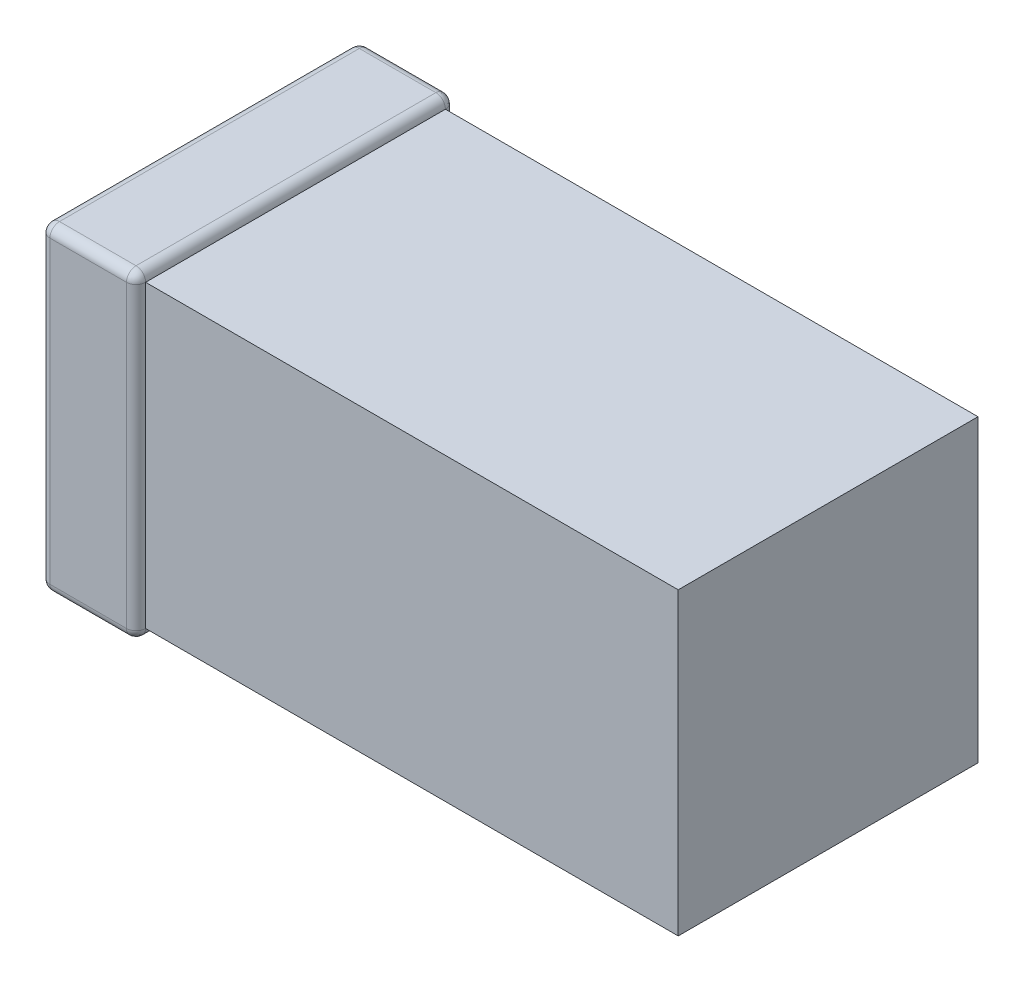
ISO-10303-21;
HEADER;
FILE_DESCRIPTION(('STEP AP214'),'2;1');
FILE_NAME('part.step','',(''),(''),'','','');
FILE_SCHEMA(('AUTOMOTIVE_DESIGN { 1 0 10303 214 1 1 1 1 }'));
ENDSEC;
DATA;
#1=APPLICATION_CONTEXT('core data for automotive mechanical design processes');
#2=APPLICATION_PROTOCOL_DEFINITION('international standard','automotive_design',2000,#1);
#3=PRODUCT_CONTEXT('',#1,'mechanical');
#4=PRODUCT('Part','Part','',(#3));
#5=PRODUCT_RELATED_PRODUCT_CATEGORY('part','',(#4));
#6=PRODUCT_DEFINITION_FORMATION('','',#4);
#7=PRODUCT_DEFINITION_CONTEXT('part definition',#1,'design');
#8=PRODUCT_DEFINITION('design','',#6,#7);
#9=PRODUCT_DEFINITION_SHAPE('','',#8);
#10=(LENGTH_UNIT() NAMED_UNIT(*) SI_UNIT(.MILLI.,.METRE.));
#11=(NAMED_UNIT(*) PLANE_ANGLE_UNIT() SI_UNIT($,.RADIAN.));
#12=(NAMED_UNIT(*) SI_UNIT($,.STERADIAN.) SOLID_ANGLE_UNIT());
#13=UNCERTAINTY_MEASURE_WITH_UNIT(LENGTH_MEASURE(1.E-05),#10,'distance_accuracy_value','');
#14=(GEOMETRIC_REPRESENTATION_CONTEXT(3) GLOBAL_UNCERTAINTY_ASSIGNED_CONTEXT((#13)) GLOBAL_UNIT_ASSIGNED_CONTEXT((#10,
#11,#12)) REPRESENTATION_CONTEXT('',''));
#15=CARTESIAN_POINT('',(0.,0.,0.));
#16=DIRECTION('',(0.,0.,1.));
#17=DIRECTION('',(1.,0.,0.));
#18=AXIS2_PLACEMENT_3D('',#15,#16,#17);
#19=CARTESIAN_POINT('',(24.0025,33.775,-0.009600000381415));
#20=CARTESIAN_POINT('',(23.993713203481,33.775,-0.009600000381411));
#21=CARTESIAN_POINT('',(23.987500000057,33.781213203383,-0.009600000381434));
#22=CARTESIAN_POINT('',(23.9875,33.789999999902,-0.00960000038147));
#23=CARTESIAN_POINT('',(24.0025,33.775,-0.0008132038170095));
#24=CARTESIAN_POINT('',(23.993713203481,33.775,-0.000813203817006));
#25=CARTESIAN_POINT('',(23.987500000057,33.781213203383,-0.0008132038170287));
#26=CARTESIAN_POINT('',(23.9875,33.789999999902,-0.0008132038170642));
#27=CARTESIAN_POINT('',(24.0025,33.781213203436,0.005399999618562));
#28=CARTESIAN_POINT('',(23.997352813769,33.781213203436,0.005399999618564));
#29=CARTESIAN_POINT('',(23.993713203469,33.784852813712,0.00539999961855));
#30=CARTESIAN_POINT('',(23.993713203436,33.789999999943,0.00539999961853));
#31=CARTESIAN_POINT('',(24.0025,33.79,0.005399999618525));
#32=CARTESIAN_POINT('',(24.0025,33.79,0.005399999618525));
#33=CARTESIAN_POINT('',(24.0025,33.79,0.005399999618525));
#34=CARTESIAN_POINT('',(24.0025,33.79,0.005399999618525));
#35=(BOUNDED_SURFACE() B_SPLINE_SURFACE(3,3,((#19,#20,#21,#22),(#23,#24,#25,#26),(#27,#28,#29,
#30),(#31,#32,#33,#34)),.UNSPECIFIED.,.F.,.F.,.F.) B_SPLINE_SURFACE_WITH_KNOTS((4,4),(4,4),(0.,
1.),(0.,1.),.UNSPECIFIED.) GEOMETRIC_REPRESENTATION_ITEM() RATIONAL_B_SPLINE_SURFACE(((1.,
0.804737855665,0.804737855665,1.),(0.804737854124,0.6476030151,0.6476030151,0.804737854124),
(0.804737854124,0.6476030151,0.6476030151,0.804737854124),(1.,0.804737855665,0.804737855665,1.))) REPRESENTATION_ITEM('') SURFACE());
#36=CARTESIAN_POINT('',(24.0025,33.79,-0.00960000038147));
#37=DIRECTION('',(0.,0.,-1.));
#38=DIRECTION('',(1.,0.,0.));
#39=AXIS2_PLACEMENT_3D('',#36,#37,#38);
#40=CIRCLE('',#39,0.015);
#41=CARTESIAN_POINT('',(24.0025,33.775,-0.009600000381442));
#42=VERTEX_POINT('',#41);
#43=CARTESIAN_POINT('',(23.9875,33.789999999988,-0.00960000038147));
#44=VERTEX_POINT('',#43);
#45=EDGE_CURVE('E30',#42,#44,#40,.T.);
#46=CARTESIAN_POINT('',(24.0025,33.79,-0.00960000038147));
#47=DIRECTION('',(1.,0.,0.));
#48=DIRECTION('',(0.,0.,1.));
#49=AXIS2_PLACEMENT_3D('',#46,#47,#48);
#50=CIRCLE('',#49,0.015);
#51=CARTESIAN_POINT('',(24.0025,33.79,0.005399999618528));
#52=VERTEX_POINT('',#51);
#53=EDGE_CURVE('E253',#52,#42,#50,.T.);
#54=CARTESIAN_POINT('',(24.0025,33.79,-0.00960000038147));
#55=DIRECTION('',(0.,1.,0.));
#56=DIRECTION('',(-1.,0.,0.));
#57=AXIS2_PLACEMENT_3D('',#54,#55,#56);
#58=CIRCLE('',#57,0.015);
#59=EDGE_CURVE('E257',#44,#52,#58,.T.);
#60=ORIENTED_EDGE('',*,*,#45,.F.);
#61=ORIENTED_EDGE('',*,*,#53,.F.);
#62=ORIENTED_EDGE('',*,*,#59,.F.);
#63=EDGE_LOOP('',(#60,#61,#62));
#64=FACE_BOUND('',#63,.T.);
#65=ADVANCED_FACE('F17',(#64),#35,.T.);
#66=CARTESIAN_POINT('',(23.9875,33.79,-0.479600000381));
#67=CARTESIAN_POINT('',(23.9875,33.79,-0.479600000381));
#68=CARTESIAN_POINT('',(23.9875,33.79,-0.479600000381));
#69=CARTESIAN_POINT('',(23.9875,33.79,-0.479600000381));
#70=CARTESIAN_POINT('',(23.9875,33.79,-0.488386796946));
#71=CARTESIAN_POINT('',(23.9875,33.784852813742,-0.488386796946));
#72=CARTESIAN_POINT('',(23.9875,33.781213203436,-0.484747186639));
#73=CARTESIAN_POINT('',(23.9875,33.781213203436,-0.479600000381));
#74=CARTESIAN_POINT('',(23.993713203436,33.79,-0.494600000382));
#75=CARTESIAN_POINT('',(23.993713203436,33.781213203436,-0.494600000381));
#76=CARTESIAN_POINT('',(23.993713203436,33.775,-0.488386796946));
#77=CARTESIAN_POINT('',(23.993713203436,33.775,-0.479600000381));
#78=CARTESIAN_POINT('',(24.0025,33.79,-0.494600000382));
#79=CARTESIAN_POINT('',(24.0025,33.781213203436,-0.494600000381));
#80=CARTESIAN_POINT('',(24.0025,33.775,-0.488386796946));
#81=CARTESIAN_POINT('',(24.0025,33.775,-0.479600000381));
#82=(BOUNDED_SURFACE() B_SPLINE_SURFACE(3,3,((#66,#67,#68,#69),(#70,#71,#72,#73),(#74,#75,#76,
#77),(#78,#79,#80,#81)),.UNSPECIFIED.,.F.,.F.,.F.) B_SPLINE_SURFACE_WITH_KNOTS((4,4),(4,4),(0.,
1.),(0.,1.),.UNSPECIFIED.) GEOMETRIC_REPRESENTATION_ITEM() RATIONAL_B_SPLINE_SURFACE(((1.,
0.804737854125,0.804737854125,1.),(0.804737854124,0.647603013861,0.647603013861,0.804737854124),
(0.804737854124,0.647603013861,0.647603013861,0.804737854124),(1.,0.804737854125,0.804737854125,1.))) REPRESENTATION_ITEM('') SURFACE());
#83=CARTESIAN_POINT('',(24.0025,33.79,-0.479600000381));
#84=DIRECTION('',(1.,0.,0.));
#85=DIRECTION('',(0.,0.,1.));
#86=AXIS2_PLACEMENT_3D('',#83,#84,#85);
#87=CIRCLE('',#86,0.015);
#88=CARTESIAN_POINT('',(24.0025,33.775,-0.479600000381));
#89=VERTEX_POINT('',#88);
#90=CARTESIAN_POINT('',(24.0025,33.79,-0.494600000381));
#91=VERTEX_POINT('',#90);
#92=EDGE_CURVE('E258',#89,#91,#87,.T.);
#93=CARTESIAN_POINT('',(24.0025,33.79,-0.479600000381));
#94=DIRECTION('',(0.,0.,1.));
#95=DIRECTION('',(1.,0.,0.));
#96=AXIS2_PLACEMENT_3D('',#93,#94,#95);
#97=CIRCLE('',#96,0.015);
#98=CARTESIAN_POINT('',(23.9875,33.79,-0.479600000381));
#99=VERTEX_POINT('',#98);
#100=EDGE_CURVE('E11',#99,#89,#97,.T.);
#101=CARTESIAN_POINT('',(24.0025,33.79,-0.479600000381));
#102=DIRECTION('',(0.,1.,0.));
#103=DIRECTION('',(-1.,0.,0.));
#104=AXIS2_PLACEMENT_3D('',#101,#102,#103);
#105=CIRCLE('',#104,0.015);
#106=EDGE_CURVE('E160',#91,#99,#105,.T.);
#107=ORIENTED_EDGE('',*,*,#92,.F.);
#108=ORIENTED_EDGE('',*,*,#100,.F.);
#109=ORIENTED_EDGE('',*,*,#106,.F.);
#110=EDGE_LOOP('',(#107,#108,#109));
#111=FACE_BOUND('',#110,.T.);
#112=ADVANCED_FACE('F478',(#111),#82,.T.);
#113=CARTESIAN_POINT('',(24.0025,33.79,0.00539999961853));
#114=DIRECTION('',(0.,0.,1.));
#115=DIRECTION('',(1.,0.,0.));
#116=AXIS2_PLACEMENT_3D('',#113,#114,#115);
#117=CYLINDRICAL_SURFACE('',#116,0.015);
#118=DIRECTION('',(0.,0.,-1.));
#119=VECTOR('',#118,1.);
#120=CARTESIAN_POINT('',(24.0025,33.775,0.00539999961853));
#121=LINE('',#120,#119);
#122=EDGE_CURVE('E287',#42,#89,#121,.T.);
#123=ORIENTED_EDGE('',*,*,#122,.F.);
#124=ORIENTED_EDGE('',*,*,#45,.T.);
#125=DIRECTION('',(0.,0.,1.));
#126=VECTOR('',#125,1.);
#127=CARTESIAN_POINT('',(23.9875,33.79,0.00539999961853));
#128=LINE('',#127,#126);
#129=EDGE_CURVE('E249',#99,#44,#128,.T.);
#130=ORIENTED_EDGE('',*,*,#129,.F.);
#131=ORIENTED_EDGE('',*,*,#100,.T.);
#132=EDGE_LOOP('',(#123,#124,#130,#131));
#133=FACE_BOUND('',#132,.T.);
#134=ADVANCED_FACE('F485',(#133),#117,.T.);
#135=CARTESIAN_POINT('',(23.9875,34.275,0.00539999961853));
#136=DIRECTION('',(-1.,0.,0.));
#137=DIRECTION('',(0.,1.,0.));
#138=AXIS2_PLACEMENT_3D('',#135,#136,#137);
#139=PLANE('',#138);
#140=ORIENTED_EDGE('',*,*,#129,.T.);
#141=DIRECTION('',(0.,-1.,0.));
#142=VECTOR('',#141,1.);
#143=CARTESIAN_POINT('',(23.9875,34.275,-0.00960000038147));
#144=LINE('',#143,#142);
#145=CARTESIAN_POINT('',(23.9875,34.26,-0.009600000381468));
#146=VERTEX_POINT('',#145);
#147=EDGE_CURVE('E245',#146,#44,#144,.T.);
#148=ORIENTED_EDGE('',*,*,#147,.F.);
#149=DIRECTION('',(0.,0.,1.));
#150=VECTOR('',#149,1.);
#151=CARTESIAN_POINT('',(23.9875,34.26,0.00539999961853));
#152=LINE('',#151,#150);
#153=CARTESIAN_POINT('',(23.9875,34.26,-0.479600000381));
#154=VERTEX_POINT('',#153);
#155=EDGE_CURVE('E288',#154,#146,#152,.T.);
#156=ORIENTED_EDGE('',*,*,#155,.F.);
#157=DIRECTION('',(0.,1.,0.));
#158=VECTOR('',#157,1.);
#159=CARTESIAN_POINT('',(23.9875,34.275,-0.479600000381));
#160=LINE('',#159,#158);
#161=EDGE_CURVE('E230',#99,#154,#160,.T.);
#162=ORIENTED_EDGE('',*,*,#161,.F.);
#163=EDGE_LOOP('',(#140,#148,#156,#162));
#164=FACE_BOUND('',#163,.T.);
#165=ADVANCED_FACE('F336',(#164),#139,.T.);
#166=CARTESIAN_POINT('',(23.9875,34.26,-0.009600000381458));
#167=CARTESIAN_POINT('',(23.9875,34.268786796562,-0.009600000381465));
#168=CARTESIAN_POINT('',(23.993713203433,34.274999999997,-0.00960000038147));
#169=CARTESIAN_POINT('',(24.002499999995,34.275,-0.00960000038147));
#170=CARTESIAN_POINT('',(23.9875,34.26,-0.000813203817055201));
#171=CARTESIAN_POINT('',(23.9875,34.268786796562,-0.0008132038170621));
#172=CARTESIAN_POINT('',(23.993713203433,34.274999999997,-0.000813203817067));
#173=CARTESIAN_POINT('',(24.002499999995,34.275,-0.000813203817067));
#174=CARTESIAN_POINT('',(23.993713203436,34.26,0.005399999618538));
#175=CARTESIAN_POINT('',(23.993713203436,34.265147186256,0.005399999618534));
#176=CARTESIAN_POINT('',(23.997352813741,34.268786796563,0.005399999618531));
#177=CARTESIAN_POINT('',(24.002499999997,34.268786796564,0.005399999618531));
#178=CARTESIAN_POINT('',(24.0025,34.26,0.005399999618534));
#179=CARTESIAN_POINT('',(24.0025,34.26,0.005399999618534));
#180=CARTESIAN_POINT('',(24.0025,34.26,0.005399999618534));
#181=CARTESIAN_POINT('',(24.0025,34.26,0.005399999618534));
#182=(BOUNDED_SURFACE() B_SPLINE_SURFACE(3,3,((#166,#167,#168,#169),(#170,#171,#172,#173),(#174,
#175,#176,#177),(#178,#179,#180,#181)),.UNSPECIFIED.,.F.,.F.,
.F.) B_SPLINE_SURFACE_WITH_KNOTS((4,4),(4,4),(0.,1.),(0.,1.),
.UNSPECIFIED.) GEOMETRIC_REPRESENTATION_ITEM() RATIONAL_B_SPLINE_SURFACE(((1.,0.804737854202,
0.804737854202,1.),(0.804737854124,0.647603013923,0.647603013923,0.804737854124),
(0.804737854124,0.647603013923,0.647603013923,0.804737854124),(1.,0.804737854202,0.804737854202,1.))) REPRESENTATION_ITEM('') SURFACE());
#183=CARTESIAN_POINT('',(24.0025,34.26,-0.00960000038147));
#184=DIRECTION('',(0.,0.,-1.));
#185=DIRECTION('',(1.,0.,0.));
#186=AXIS2_PLACEMENT_3D('',#183,#184,#185);
#187=CIRCLE('',#186,0.015);
#188=CARTESIAN_POINT('',(24.002499999998,34.275,-0.00960000038147));
#189=VERTEX_POINT('',#188);
#190=EDGE_CURVE('E284',#146,#189,#187,.T.);
#191=CARTESIAN_POINT('',(24.0025,34.26,-0.00960000038147));
#192=DIRECTION('',(0.,-1.,0.));
#193=DIRECTION('',(-1.,0.,-2.97590908802E-13));
#194=AXIS2_PLACEMENT_3D('',#191,#192,#193);
#195=CIRCLE('',#194,0.015);
#196=CARTESIAN_POINT('',(24.0025,34.26,0.005399999618532));
#197=VERTEX_POINT('',#196);
#198=EDGE_CURVE('E250',#197,#146,#195,.T.);
#199=CARTESIAN_POINT('',(24.0025,34.26,-0.00960000038147));
#200=DIRECTION('',(1.,0.,0.));
#201=DIRECTION('',(0.,0.,-1.));
#202=AXIS2_PLACEMENT_3D('',#199,#200,#201);
#203=CIRCLE('',#202,0.015);
#204=EDGE_CURVE('E177',#189,#197,#203,.T.);
#205=ORIENTED_EDGE('',*,*,#190,.F.);
#206=ORIENTED_EDGE('',*,*,#198,.F.);
#207=ORIENTED_EDGE('',*,*,#204,.F.);
#208=EDGE_LOOP('',(#205,#206,#207));
#209=FACE_BOUND('',#208,.T.);
#210=ADVANCED_FACE('F19',(#209),#182,.T.);
#211=CARTESIAN_POINT('',(24.0025,34.275,-0.479600000381));
#212=CARTESIAN_POINT('',(24.0025,34.275,-0.479600000381));
#213=CARTESIAN_POINT('',(24.0025,34.275,-0.479600000381));
#214=CARTESIAN_POINT('',(24.0025,34.275,-0.479600000381));
#215=CARTESIAN_POINT('',(24.0025,34.275,-0.488386796946));
#216=CARTESIAN_POINT('',(23.997352813742,34.275,-0.488386796946));
#217=CARTESIAN_POINT('',(23.993713203435,34.275,-0.484747186639));
#218=CARTESIAN_POINT('',(23.993713203436,34.275,-0.479600000381));
#219=CARTESIAN_POINT('',(24.0025,34.268786796564,-0.494600000381));
#220=CARTESIAN_POINT('',(23.993713203435,34.268786796564,-0.494600000381));
#221=CARTESIAN_POINT('',(23.9875,34.268786796564,-0.488386796946));
#222=CARTESIAN_POINT('',(23.9875,34.268786796564,-0.479600000381));
#223=CARTESIAN_POINT('',(24.0025,34.26,-0.494600000381));
#224=CARTESIAN_POINT('',(23.993713203436,34.26,-0.494600000381));
#225=CARTESIAN_POINT('',(23.9875,34.26,-0.488386796946));
#226=CARTESIAN_POINT('',(23.9875,34.26,-0.479600000381));
#227=(BOUNDED_SURFACE() B_SPLINE_SURFACE(3,3,((#211,#212,#213,#214),(#215,#216,#217,#218),(#219,
#220,#221,#222),(#223,#224,#225,#226)),.UNSPECIFIED.,.F.,.F.,
.F.) B_SPLINE_SURFACE_WITH_KNOTS((4,4),(4,4),(0.,1.),(0.,1.),
.UNSPECIFIED.) GEOMETRIC_REPRESENTATION_ITEM() RATIONAL_B_SPLINE_SURFACE(((1.,0.804737854125,
0.804737854125,1.),(0.804737854124,0.647603013861,0.647603013861,0.804737854124),
(0.804737854124,0.647603013861,0.647603013861,0.804737854124),(1.,0.804737854125,0.804737854125,1.))) REPRESENTATION_ITEM('') SURFACE());
#228=CARTESIAN_POINT('',(24.0025,34.26,-0.479600000381));
#229=DIRECTION('',(0.,-1.,0.));
#230=DIRECTION('',(-1.,0.,0.));
#231=AXIS2_PLACEMENT_3D('',#228,#229,#230);
#232=CIRCLE('',#231,0.015);
#233=CARTESIAN_POINT('',(24.0025,34.26,-0.494600000381));
#234=VERTEX_POINT('',#233);
#235=EDGE_CURVE('E234',#154,#234,#232,.T.);
#236=CARTESIAN_POINT('',(24.0025,34.26,-0.479600000381));
#237=DIRECTION('',(0.,0.,1.));
#238=DIRECTION('',(1.,0.,0.));
#239=AXIS2_PLACEMENT_3D('',#236,#237,#238);
#240=CIRCLE('',#239,0.015);
#241=CARTESIAN_POINT('',(24.0025,34.275,-0.479600000381));
#242=VERTEX_POINT('',#241);
#243=EDGE_CURVE('E238',#242,#154,#240,.T.);
#244=CARTESIAN_POINT('',(24.0025,34.26,-0.479600000381));
#245=DIRECTION('',(1.,0.,0.));
#246=DIRECTION('',(0.,0.,-1.));
#247=AXIS2_PLACEMENT_3D('',#244,#245,#246);
#248=CIRCLE('',#247,0.015);
#249=EDGE_CURVE('E165',#234,#242,#248,.T.);
#250=ORIENTED_EDGE('',*,*,#235,.F.);
#251=ORIENTED_EDGE('',*,*,#243,.F.);
#252=ORIENTED_EDGE('',*,*,#249,.F.);
#253=EDGE_LOOP('',(#250,#251,#252));
#254=FACE_BOUND('',#253,.T.);
#255=ADVANCED_FACE('F509',(#254),#227,.T.);
#256=CARTESIAN_POINT('',(24.0025,34.275,-0.00960000038147));
#257=DIRECTION('',(0.,1.,0.));
#258=DIRECTION('',(-1.,0.,0.));
#259=AXIS2_PLACEMENT_3D('',#256,#257,#258);
#260=CYLINDRICAL_SURFACE('',#259,0.015);
#261=ORIENTED_EDGE('',*,*,#59,.T.);
#262=DIRECTION('',(0.,1.,0.));
#263=VECTOR('',#262,1.);
#264=CARTESIAN_POINT('',(24.0025,33.775,0.00539999961853));
#265=LINE('',#264,#263);
#266=EDGE_CURVE('E162',#52,#197,#265,.T.);
#267=ORIENTED_EDGE('',*,*,#266,.T.);
#268=ORIENTED_EDGE('',*,*,#198,.T.);
#269=ORIENTED_EDGE('',*,*,#147,.T.);
#270=EDGE_LOOP('',(#261,#267,#268,#269));
#271=FACE_BOUND('',#270,.T.);
#272=ADVANCED_FACE('F503',(#271),#260,.T.);
#273=CARTESIAN_POINT('',(23.9875,33.79,-0.00960000038147));
#274=DIRECTION('',(-1.,0.,0.));
#275=DIRECTION('',(0.,0.,1.));
#276=AXIS2_PLACEMENT_3D('',#273,#274,#275);
#277=CYLINDRICAL_SURFACE('',#276,0.015);
#278=DIRECTION('',(-1.,0.,0.));
#279=VECTOR('',#278,1.);
#280=CARTESIAN_POINT('',(23.9875,33.775,-0.00960000038147));
#281=LINE('',#280,#279);
#282=CARTESIAN_POINT('',(24.122499999999,33.775,-0.00960000038147));
#283=VERTEX_POINT('',#282);
#284=EDGE_CURVE('E235',#283,#42,#281,.T.);
#285=ORIENTED_EDGE('',*,*,#284,.F.);
#286=CARTESIAN_POINT('',(24.1225,33.79,-0.00960000038146));
#287=DIRECTION('',(1.,-3.270547051999E-10,0.));
#288=DIRECTION('',(0.,0.,-1.));
#289=AXIS2_PLACEMENT_3D('',#286,#287,#288);
#290=CIRCLE('',#289,0.01499999999996);
#291=CARTESIAN_POINT('',(24.1225,33.79,0.005399999618526));
#292=VERTEX_POINT('',#291);
#293=EDGE_CURVE('E191',#292,#283,#290,.T.);
#294=ORIENTED_EDGE('',*,*,#293,.F.);
#295=DIRECTION('',(-1.,0.,0.));
#296=VECTOR('',#295,1.);
#297=CARTESIAN_POINT('',(23.9875,33.79,0.00539999961853));
#298=LINE('',#297,#296);
#299=EDGE_CURVE('E180',#292,#52,#298,.T.);
#300=ORIENTED_EDGE('',*,*,#299,.T.);
#301=ORIENTED_EDGE('',*,*,#53,.T.);
#302=EDGE_LOOP('',(#285,#294,#300,#301));
#303=FACE_BOUND('',#302,.T.);
#304=ADVANCED_FACE('F402',(#303),#277,.T.);
#305=CARTESIAN_POINT('',(23.9875,33.79,-0.479600000381));
#306=DIRECTION('',(-1.,0.,0.));
#307=DIRECTION('',(0.,0.,1.));
#308=AXIS2_PLACEMENT_3D('',#305,#306,#307);
#309=CYLINDRICAL_SURFACE('',#308,0.015);
#310=ORIENTED_EDGE('',*,*,#92,.T.);
#311=DIRECTION('',(-1.,0.,0.));
#312=VECTOR('',#311,1.);
#313=CARTESIAN_POINT('',(23.9875,33.79,-0.494600000381));
#314=LINE('',#313,#312);
#315=CARTESIAN_POINT('',(24.1225,33.79,-0.494600000381));
#316=VERTEX_POINT('',#315);
#317=EDGE_CURVE('E219',#316,#91,#314,.T.);
#318=ORIENTED_EDGE('',*,*,#317,.F.);
#319=CARTESIAN_POINT('',(24.1225,33.79,-0.479600000381));
#320=DIRECTION('',(1.,-1.191138301634E-13,-2.7639343287665E-12));
#321=DIRECTION('',(2.763934328766E-12,-4.163336342347E-12,1.));
#322=AXIS2_PLACEMENT_3D('',#319,#320,#321);
#323=CIRCLE('',#322,0.01499999999999);
#324=CARTESIAN_POINT('',(24.1225,33.775,-0.479600000381));
#325=VERTEX_POINT('',#324);
#326=EDGE_CURVE('E194',#325,#316,#323,.T.);
#327=ORIENTED_EDGE('',*,*,#326,.F.);
#328=DIRECTION('',(1.,0.,0.));
#329=VECTOR('',#328,1.);
#330=CARTESIAN_POINT('',(23.9875,33.775,-0.479600000381));
#331=LINE('',#330,#329);
#332=EDGE_CURVE('E289',#89,#325,#331,.T.);
#333=ORIENTED_EDGE('',*,*,#332,.F.);
#334=EDGE_LOOP('',(#310,#318,#327,#333));
#335=FACE_BOUND('',#334,.T.);
#336=ADVANCED_FACE('F502',(#335),#309,.T.);
#337=CARTESIAN_POINT('',(24.0025,34.275,-0.479600000381));
#338=DIRECTION('',(0.,1.,0.));
#339=DIRECTION('',(-1.,0.,0.));
#340=AXIS2_PLACEMENT_3D('',#337,#338,#339);
#341=CYLINDRICAL_SURFACE('',#340,0.015);
#342=ORIENTED_EDGE('',*,*,#161,.T.);
#343=ORIENTED_EDGE('',*,*,#235,.T.);
#344=DIRECTION('',(0.,1.,0.));
#345=VECTOR('',#344,1.);
#346=CARTESIAN_POINT('',(24.0025,33.775,-0.494600000381));
#347=LINE('',#346,#345);
#348=EDGE_CURVE('E209',#91,#234,#347,.T.);
#349=ORIENTED_EDGE('',*,*,#348,.F.);
#350=ORIENTED_EDGE('',*,*,#106,.T.);
#351=EDGE_LOOP('',(#342,#343,#349,#350));
#352=FACE_BOUND('',#351,.T.);
#353=ADVANCED_FACE('F332',(#352),#341,.T.);
#354=CARTESIAN_POINT('',(23.9875,33.775,0.00539999961853));
#355=DIRECTION('',(0.,-1.,0.));
#356=DIRECTION('',(0.,0.,-1.));
#357=AXIS2_PLACEMENT_3D('',#354,#355,#356);
#358=PLANE('',#357);
#359=ORIENTED_EDGE('',*,*,#122,.T.);
#360=ORIENTED_EDGE('',*,*,#332,.T.);
#361=DIRECTION('',(0.,0.,-1.));
#362=VECTOR('',#361,1.);
#363=CARTESIAN_POINT('',(24.1225,33.775,0.00539999961853));
#364=LINE('',#363,#362);
#365=EDGE_CURVE('E23',#283,#325,#364,.T.);
#366=ORIENTED_EDGE('',*,*,#365,.F.);
#367=ORIENTED_EDGE('',*,*,#284,.T.);
#368=EDGE_LOOP('',(#359,#360,#366,#367));
#369=FACE_BOUND('',#368,.T.);
#370=ADVANCED_FACE('F411',(#369),#358,.T.);
#371=CARTESIAN_POINT('',(24.0025,34.26,0.00539999961853));
#372=DIRECTION('',(0.,0.,1.));
#373=DIRECTION('',(1.,0.,0.));
#374=AXIS2_PLACEMENT_3D('',#371,#372,#373);
#375=CYLINDRICAL_SURFACE('',#374,0.015);
#376=DIRECTION('',(0.,0.,1.));
#377=VECTOR('',#376,1.);
#378=CARTESIAN_POINT('',(24.0025,34.275,0.00539999961853));
#379=LINE('',#378,#377);
#380=EDGE_CURVE('E279',#242,#189,#379,.T.);
#381=ORIENTED_EDGE('',*,*,#380,.F.);
#382=ORIENTED_EDGE('',*,*,#243,.T.);
#383=ORIENTED_EDGE('',*,*,#155,.T.);
#384=ORIENTED_EDGE('',*,*,#190,.T.);
#385=EDGE_LOOP('',(#381,#382,#383,#384));
#386=FACE_BOUND('',#385,.T.);
#387=ADVANCED_FACE('F341',(#386),#375,.T.);
#388=CARTESIAN_POINT('',(24.1375,34.26,-0.00960000038147));
#389=DIRECTION('',(1.,0.,0.));
#390=DIRECTION('',(0.,0.,-1.));
#391=AXIS2_PLACEMENT_3D('',#388,#389,#390);
#392=CYLINDRICAL_SURFACE('',#391,0.015);
#393=DIRECTION('',(1.,0.,0.));
#394=VECTOR('',#393,1.);
#395=CARTESIAN_POINT('',(24.1375,34.275,-0.00960000038147));
#396=LINE('',#395,#394);
#397=CARTESIAN_POINT('',(24.1225,34.275,-0.00960000037833));
#398=VERTEX_POINT('',#397);
#399=EDGE_CURVE('E282',#189,#398,#396,.T.);
#400=ORIENTED_EDGE('',*,*,#399,.F.);
#401=ORIENTED_EDGE('',*,*,#204,.T.);
#402=DIRECTION('',(1.,0.,0.));
#403=VECTOR('',#402,1.);
#404=CARTESIAN_POINT('',(23.9875,34.26,0.00539999961853));
#405=LINE('',#404,#403);
#406=CARTESIAN_POINT('',(24.1225,34.26,0.005399999618529));
#407=VERTEX_POINT('',#406);
#408=EDGE_CURVE('E166',#197,#407,#405,.T.);
#409=ORIENTED_EDGE('',*,*,#408,.T.);
#410=CARTESIAN_POINT('',(24.1225,34.26,-0.009600000381487));
#411=DIRECTION('',(1.,7.896955224877E-13,0.));
#412=DIRECTION('',(7.896955224877E-13,-1.,0.));
#413=AXIS2_PLACEMENT_3D('',#410,#411,#412);
#414=CIRCLE('',#413,0.01500000000001);
#415=EDGE_CURVE('E276',#398,#407,#414,.T.);
#416=ORIENTED_EDGE('',*,*,#415,.F.);
#417=EDGE_LOOP('',(#400,#401,#409,#416));
#418=FACE_BOUND('',#417,.T.);
#419=ADVANCED_FACE('F472',(#418),#392,.T.);
#420=CARTESIAN_POINT('',(24.1375,34.26,-0.479600000381));
#421=DIRECTION('',(1.,0.,0.));
#422=DIRECTION('',(0.,0.,-1.));
#423=AXIS2_PLACEMENT_3D('',#420,#421,#422);
#424=CYLINDRICAL_SURFACE('',#423,0.015);
#425=CARTESIAN_POINT('',(24.1225,34.26,-0.479600000381));
#426=DIRECTION('',(1.,0.,0.));
#427=DIRECTION('',(0.,0.,-1.));
#428=AXIS2_PLACEMENT_3D('',#425,#426,#427);
#429=CIRCLE('',#428,0.01499999999987);
#430=CARTESIAN_POINT('',(24.1225,34.26,-0.494600000381));
#431=VERTEX_POINT('',#430);
#432=CARTESIAN_POINT('',(24.1225,34.275,-0.479600000381));
#433=VERTEX_POINT('',#432);
#434=EDGE_CURVE('E273',#431,#433,#429,.T.);
#435=ORIENTED_EDGE('',*,*,#434,.F.);
#436=DIRECTION('',(1.,0.,0.));
#437=VECTOR('',#436,1.);
#438=CARTESIAN_POINT('',(23.9875,34.26,-0.494600000381));
#439=LINE('',#438,#437);
#440=EDGE_CURVE('E196',#234,#431,#439,.T.);
#441=ORIENTED_EDGE('',*,*,#440,.F.);
#442=ORIENTED_EDGE('',*,*,#249,.T.);
#443=DIRECTION('',(-1.,0.,0.));
#444=VECTOR('',#443,1.);
#445=CARTESIAN_POINT('',(24.1375,34.275,-0.479600000381));
#446=LINE('',#445,#444);
#447=EDGE_CURVE('E296',#433,#242,#446,.T.);
#448=ORIENTED_EDGE('',*,*,#447,.F.);
#449=EDGE_LOOP('',(#435,#441,#442,#448));
#450=FACE_BOUND('',#449,.T.);
#451=ADVANCED_FACE('F462',(#450),#424,.T.);
#452=CARTESIAN_POINT('',(23.9875,33.775,0.00539999961853));
#453=DIRECTION('',(0.,0.,-1.));
#454=DIRECTION('',(-1.,0.,0.));
#455=AXIS2_PLACEMENT_3D('',#452,#453,#454);
#456=PLANE('',#455);
#457=ORIENTED_EDGE('',*,*,#299,.F.);
#458=DIRECTION('',(0.,-1.,0.));
#459=VECTOR('',#458,1.);
#460=CARTESIAN_POINT('',(24.1225,33.775,0.00539999961853));
#461=LINE('',#460,#459);
#462=EDGE_CURVE('E311',#407,#292,#461,.T.);
#463=ORIENTED_EDGE('',*,*,#462,.F.);
#464=ORIENTED_EDGE('',*,*,#408,.F.);
#465=ORIENTED_EDGE('',*,*,#266,.F.);
#466=EDGE_LOOP('',(#457,#463,#464,#465));
#467=FACE_BOUND('',#466,.T.);
#468=ADVANCED_FACE('F459',(#467),#456,.F.);
#469=CARTESIAN_POINT('',(24.1375,33.79,-0.00960000038147));
#470=CARTESIAN_POINT('',(24.1375,33.781213203433,-0.00960000038147));
#471=CARTESIAN_POINT('',(24.131286796562,33.774999999997,-0.00960000038147));
#472=CARTESIAN_POINT('',(24.122499999995,33.775,-0.00960000038147));
#473=CARTESIAN_POINT('',(24.1375,33.79,-0.0008132038170864));
#474=CARTESIAN_POINT('',(24.1375,33.781213203433,-0.000813203817086401));
#475=CARTESIAN_POINT('',(24.131286796562,33.774999999997,-0.000813203817086401));
#476=CARTESIAN_POINT('',(24.122499999995,33.775,-0.0008132038170864));
#477=CARTESIAN_POINT('',(24.131286796564,33.79,0.005399999618497));
#478=CARTESIAN_POINT('',(24.131286796564,33.784852813741,0.005399999618497));
#479=CARTESIAN_POINT('',(24.127647186256,33.781213203434,0.005399999618497));
#480=CARTESIAN_POINT('',(24.122499999997,33.781213203436,0.005399999618497));
#481=CARTESIAN_POINT('',(24.1225,33.79,0.005399999618495));
#482=CARTESIAN_POINT('',(24.1225,33.79,0.005399999618495));
#483=CARTESIAN_POINT('',(24.1225,33.79,0.005399999618495));
#484=CARTESIAN_POINT('',(24.1225,33.79,0.005399999618495));
#485=(BOUNDED_SURFACE() B_SPLINE_SURFACE(3,3,((#469,#470,#471,#472),(#473,#474,#475,#476),(#477,
#478,#479,#480),(#481,#482,#483,#484)),.UNSPECIFIED.,.F.,.F.,
.F.) B_SPLINE_SURFACE_WITH_KNOTS((4,4),(4,4),(0.,1.),(0.,1.),
.UNSPECIFIED.) GEOMETRIC_REPRESENTATION_ITEM() RATIONAL_B_SPLINE_SURFACE(((1.,0.804737854047,
0.804737854047,1.),(0.804737854124,0.647603013799,0.647603013799,0.804737854124),
(0.804737854124,0.647603013799,0.647603013799,0.804737854124),(1.,0.804737854047,0.804737854047,1.))) REPRESENTATION_ITEM('') SURFACE());
#486=CARTESIAN_POINT('',(24.1225,33.79,-0.00960000038147));
#487=DIRECTION('',(0.,0.,-1.));
#488=DIRECTION('',(1.,0.,0.));
#489=AXIS2_PLACEMENT_3D('',#486,#487,#488);
#490=CIRCLE('',#489,0.015);
#491=CARTESIAN_POINT('',(24.1375,33.79,-0.00960000038147));
#492=VERTEX_POINT('',#491);
#493=EDGE_CURVE('E295',#492,#283,#490,.T.);
#494=CARTESIAN_POINT('',(24.1225,33.79,-0.00960000038147));
#495=DIRECTION('',(0.,1.,0.));
#496=DIRECTION('',(1.,0.,0.));
#497=AXIS2_PLACEMENT_3D('',#494,#495,#496);
#498=CIRCLE('',#497,0.015);
#499=EDGE_CURVE('E277',#292,#492,#498,.T.);
#500=ORIENTED_EDGE('',*,*,#493,.F.);
#501=ORIENTED_EDGE('',*,*,#499,.F.);
#502=ORIENTED_EDGE('',*,*,#293,.T.);
#503=EDGE_LOOP('',(#500,#501,#502));
#504=FACE_BOUND('',#503,.T.);
#505=ADVANCED_FACE('F409',(#504),#485,.T.);
#506=CARTESIAN_POINT('',(24.1225,33.775,-0.479600000381));
#507=CARTESIAN_POINT('',(24.131286796519,33.775,-0.479600000382));
#508=CARTESIAN_POINT('',(24.137499999943,33.781213203383,-0.479600000382));
#509=CARTESIAN_POINT('',(24.1375,33.789999999902,-0.479600000381));
#510=CARTESIAN_POINT('',(24.1225,33.775,-0.488386796946));
#511=CARTESIAN_POINT('',(24.131286796519,33.775,-0.488386796946));
#512=CARTESIAN_POINT('',(24.137499999943,33.781213203383,-0.488386796946));
#513=CARTESIAN_POINT('',(24.1375,33.789999999902,-0.488386796946));
#514=CARTESIAN_POINT('',(24.1225,33.781213203436,-0.494600000382));
#515=CARTESIAN_POINT('',(24.127647186231,33.781213203436,-0.494600000382));
#516=CARTESIAN_POINT('',(24.131286796531,33.784852813712,-0.494600000382));
#517=CARTESIAN_POINT('',(24.131286796564,33.789999999943,-0.494600000382));
#518=CARTESIAN_POINT('',(24.1225,33.79,-0.494600000381));
#519=CARTESIAN_POINT('',(24.1225,33.79,-0.494600000381));
#520=CARTESIAN_POINT('',(24.1225,33.79,-0.494600000381));
#521=CARTESIAN_POINT('',(24.1225,33.79,-0.494600000381));
#522=(BOUNDED_SURFACE() B_SPLINE_SURFACE(3,3,((#506,#507,#508,#509),(#510,#511,#512,#513),(#514,
#515,#516,#517),(#518,#519,#520,#521)),.UNSPECIFIED.,.F.,.F.,
.F.) B_SPLINE_SURFACE_WITH_KNOTS((4,4),(4,4),(0.,1.),(0.,1.),
.UNSPECIFIED.) GEOMETRIC_REPRESENTATION_ITEM() RATIONAL_B_SPLINE_SURFACE(((1.,0.804737855665,
0.804737855665,1.),(0.804737854123,0.647603015099,0.647603015099,0.804737854123),
(0.804737854123,0.647603015099,0.647603015099,0.804737854123),(1.,0.804737855665,0.804737855665,1.))) REPRESENTATION_ITEM('') SURFACE());
#523=CARTESIAN_POINT('',(24.1225,33.79,-0.479600000381));
#524=DIRECTION('',(0.,0.,1.));
#525=DIRECTION('',(1.,0.,0.));
#526=AXIS2_PLACEMENT_3D('',#523,#524,#525);
#527=CIRCLE('',#526,0.015);
#528=CARTESIAN_POINT('',(24.1375,33.789999999951,-0.479600000381));
#529=VERTEX_POINT('',#528);
#530=EDGE_CURVE('E292',#325,#529,#527,.T.);
#531=CARTESIAN_POINT('',(24.1225,33.79,-0.479600000381));
#532=DIRECTION('',(0.,1.,0.));
#533=DIRECTION('',(1.,0.,0.));
#534=AXIS2_PLACEMENT_3D('',#531,#532,#533);
#535=CIRCLE('',#534,0.015);
#536=EDGE_CURVE('E259',#529,#316,#535,.T.);
#537=ORIENTED_EDGE('',*,*,#530,.F.);
#538=ORIENTED_EDGE('',*,*,#326,.T.);
#539=ORIENTED_EDGE('',*,*,#536,.F.);
#540=EDGE_LOOP('',(#537,#538,#539));
#541=FACE_BOUND('',#540,.T.);
#542=ADVANCED_FACE('F470',(#541),#522,.T.);
#543=CARTESIAN_POINT('',(23.9875,33.775,-0.494600000381));
#544=DIRECTION('',(0.,0.,-1.));
#545=DIRECTION('',(-1.,0.,0.));
#546=AXIS2_PLACEMENT_3D('',#543,#544,#545);
#547=PLANE('',#546);
#548=ORIENTED_EDGE('',*,*,#317,.T.);
#549=ORIENTED_EDGE('',*,*,#348,.T.);
#550=ORIENTED_EDGE('',*,*,#440,.T.);
#551=DIRECTION('',(0.,1.,0.));
#552=VECTOR('',#551,1.);
#553=CARTESIAN_POINT('',(24.1225,33.775,-0.494600000381));
#554=LINE('',#553,#552);
#555=EDGE_CURVE('E228',#316,#431,#554,.T.);
#556=ORIENTED_EDGE('',*,*,#555,.F.);
#557=EDGE_LOOP('',(#548,#549,#550,#556));
#558=FACE_BOUND('',#557,.T.);
#559=ADVANCED_FACE('F524',(#558),#547,.T.);
#560=CARTESIAN_POINT('',(24.1225,33.79,0.00539999961853));
#561=DIRECTION('',(0.,0.,1.));
#562=DIRECTION('',(1.,0.,0.));
#563=AXIS2_PLACEMENT_3D('',#560,#561,#562);
#564=CYLINDRICAL_SURFACE('',#563,0.015);
#565=ORIENTED_EDGE('',*,*,#530,.T.);
#566=DIRECTION('',(0.,0.,-1.));
#567=VECTOR('',#566,1.);
#568=CARTESIAN_POINT('',(24.1375,33.79,-0.00960000038147));
#569=LINE('',#568,#567);
#570=EDGE_CURVE('E262',#492,#529,#569,.T.);
#571=ORIENTED_EDGE('',*,*,#570,.F.);
#572=ORIENTED_EDGE('',*,*,#493,.T.);
#573=ORIENTED_EDGE('',*,*,#365,.T.);
#574=EDGE_LOOP('',(#565,#571,#572,#573));
#575=FACE_BOUND('',#574,.T.);
#576=ADVANCED_FACE('F415',(#575),#564,.T.);
#577=CARTESIAN_POINT('',(24.1375,34.275,0.00539999961853));
#578=DIRECTION('',(0.,1.,0.));
#579=DIRECTION('',(1.,0.,0.));
#580=AXIS2_PLACEMENT_3D('',#577,#578,#579);
#581=PLANE('',#580);
#582=ORIENTED_EDGE('',*,*,#380,.T.);
#583=ORIENTED_EDGE('',*,*,#399,.T.);
#584=DIRECTION('',(0.,0.,1.));
#585=VECTOR('',#584,1.);
#586=CARTESIAN_POINT('',(24.1225,34.275,0.00539999961853));
#587=LINE('',#586,#585);
#588=EDGE_CURVE('E434',#433,#398,#587,.T.);
#589=ORIENTED_EDGE('',*,*,#588,.F.);
#590=ORIENTED_EDGE('',*,*,#447,.T.);
#591=EDGE_LOOP('',(#582,#583,#589,#590));
#592=FACE_BOUND('',#591,.T.);
#593=ADVANCED_FACE('F532',(#592),#581,.T.);
#594=CARTESIAN_POINT('',(24.1225,34.26,0.005399999618523));
#595=CARTESIAN_POINT('',(24.1225,34.268786796553,0.005399999618523));
#596=CARTESIAN_POINT('',(24.1225,34.274999999985,-0.0008132038036133));
#597=CARTESIAN_POINT('',(24.1225,34.275,-0.009600000356352));
#598=CARTESIAN_POINT('',(24.131286796564,34.26,0.005399999618519));
#599=CARTESIAN_POINT('',(24.131286796564,34.268786796553,0.005399999618519));
#600=CARTESIAN_POINT('',(24.131286796564,34.274999999985,-0.0008132038036173));
#601=CARTESIAN_POINT('',(24.131286796564,34.275,-0.00960000035635199));
#602=CARTESIAN_POINT('',(24.1375,34.26,-0.0008132038170825));
#603=CARTESIAN_POINT('',(24.1375,34.265147186251,-0.0008132038170825));
#604=CARTESIAN_POINT('',(24.1375,34.268786796556,-0.004452814115982));
#605=CARTESIAN_POINT('',(24.1375,34.268786796564,-0.009600000366761));
#606=CARTESIAN_POINT('',(24.1375,34.26,-0.009600000381489));
#607=CARTESIAN_POINT('',(24.1375,34.26,-0.009600000381489));
#608=CARTESIAN_POINT('',(24.1375,34.26,-0.009600000381485));
#609=CARTESIAN_POINT('',(24.1375,34.26,-0.009600000381485));
#610=(BOUNDED_SURFACE() B_SPLINE_SURFACE(3,3,((#594,#595,#596,#597),(#598,#599,#600,#601),(#602,
#603,#604,#605),(#606,#607,#608,#609)),.UNSPECIFIED.,.F.,.F.,
.F.) B_SPLINE_SURFACE_WITH_KNOTS((4,4),(4,4),(0.,1.),(0.,1.),
.UNSPECIFIED.) GEOMETRIC_REPRESENTATION_ITEM() RATIONAL_B_SPLINE_SURFACE(((1.,0.804737854519,
0.804737854519,1.),(0.804737854124,0.647603014179,0.647603014179,0.804737854124),
(0.804737854124,0.647603014179,0.647603014179,0.804737854124),(1.,0.804737854519,0.804737854519,1.))) REPRESENTATION_ITEM('') SURFACE());
#611=CARTESIAN_POINT('',(24.1225,34.26,-0.00960000038147));
#612=DIRECTION('',(0.,-1.,0.));
#613=DIRECTION('',(1.,0.,0.));
#614=AXIS2_PLACEMENT_3D('',#611,#612,#613);
#615=CIRCLE('',#614,0.015);
#616=CARTESIAN_POINT('',(24.1375,34.26,-0.009600000381479));
#617=VERTEX_POINT('',#616);
#618=EDGE_CURVE('E227',#617,#407,#615,.T.);
#619=CARTESIAN_POINT('',(24.1225,34.26,-0.00960000038147));
#620=DIRECTION('',(0.,0.,-1.));
#621=DIRECTION('',(1.,-1.387778780781E-12,0.));
#622=AXIS2_PLACEMENT_3D('',#619,#620,#621);
#623=CIRCLE('',#622,0.015);
#624=EDGE_CURVE('E307',#398,#617,#623,.T.);
#625=ORIENTED_EDGE('',*,*,#415,.T.);
#626=ORIENTED_EDGE('',*,*,#618,.F.);
#627=ORIENTED_EDGE('',*,*,#624,.F.);
#628=EDGE_LOOP('',(#625,#626,#627));
#629=FACE_BOUND('',#628,.T.);
#630=ADVANCED_FACE('F491',(#629),#610,.T.);
#631=CARTESIAN_POINT('',(24.1225,34.26,-0.494600000381));
#632=CARTESIAN_POINT('',(24.1225,34.26,-0.494600000381));
#633=CARTESIAN_POINT('',(24.1225,34.26,-0.494600000381));
#634=CARTESIAN_POINT('',(24.1225,34.26,-0.494600000381));
#635=CARTESIAN_POINT('',(24.1225,34.268786796564,-0.494600000381));
#636=CARTESIAN_POINT('',(24.127647186258,34.268786796564,-0.494600000381));
#637=CARTESIAN_POINT('',(24.131286796564,34.265147186258,-0.494600000381));
#638=CARTESIAN_POINT('',(24.131286796564,34.26,-0.494600000381));
#639=CARTESIAN_POINT('',(24.1225,34.275,-0.488386796946));
#640=CARTESIAN_POINT('',(24.131286796564,34.275,-0.488386796946));
#641=CARTESIAN_POINT('',(24.1375,34.268786796564,-0.488386796946));
#642=CARTESIAN_POINT('',(24.1375,34.26,-0.488386796946));
#643=CARTESIAN_POINT('',(24.1225,34.275,-0.479600000381));
#644=CARTESIAN_POINT('',(24.131286796564,34.275,-0.479600000381));
#645=CARTESIAN_POINT('',(24.1375,34.268786796564,-0.479600000381));
#646=CARTESIAN_POINT('',(24.1375,34.26,-0.479600000381));
#647=(BOUNDED_SURFACE() B_SPLINE_SURFACE(3,3,((#631,#632,#633,#634),(#635,#636,#637,#638),(#639,
#640,#641,#642),(#643,#644,#645,#646)),.UNSPECIFIED.,.F.,.F.,
.F.) B_SPLINE_SURFACE_WITH_KNOTS((4,4),(4,4),(0.,1.),(0.,1.),
.UNSPECIFIED.) GEOMETRIC_REPRESENTATION_ITEM() RATIONAL_B_SPLINE_SURFACE(((1.,0.804737854124,
0.804737854124,1.),(0.804737854124,0.64760301386,0.64760301386,0.804737854124),(0.804737854124,
0.64760301386,0.64760301386,0.804737854124),(1.,0.804737854124,0.804737854124,1.))) REPRESENTATION_ITEM('') SURFACE());
#648=CARTESIAN_POINT('',(24.1225,34.26,-0.479600000381));
#649=DIRECTION('',(0.,0.,1.));
#650=DIRECTION('',(1.,0.,0.));
#651=AXIS2_PLACEMENT_3D('',#648,#649,#650);
#652=CIRCLE('',#651,0.015);
#653=CARTESIAN_POINT('',(24.1375,34.26,-0.479600000381));
#654=VERTEX_POINT('',#653);
#655=EDGE_CURVE('E223',#654,#433,#652,.T.);
#656=CARTESIAN_POINT('',(24.1225,34.26,-0.479600000381));
#657=DIRECTION('',(0.,-1.,0.));
#658=DIRECTION('',(1.,0.,0.));
#659=AXIS2_PLACEMENT_3D('',#656,#657,#658);
#660=CIRCLE('',#659,0.015);
#661=EDGE_CURVE('E225',#431,#654,#660,.T.);
#662=ORIENTED_EDGE('',*,*,#655,.F.);
#663=ORIENTED_EDGE('',*,*,#661,.F.);
#664=ORIENTED_EDGE('',*,*,#434,.T.);
#665=EDGE_LOOP('',(#662,#663,#664));
#666=FACE_BOUND('',#665,.T.);
#667=ADVANCED_FACE('F571',(#666),#647,.T.);
#668=CARTESIAN_POINT('',(24.1225,33.775,-0.00960000038147));
#669=DIRECTION('',(0.,-1.,0.));
#670=DIRECTION('',(1.,0.,0.));
#671=AXIS2_PLACEMENT_3D('',#668,#669,#670);
#672=CYLINDRICAL_SURFACE('',#671,0.015);
#673=DIRECTION('',(0.,1.,0.));
#674=VECTOR('',#673,1.);
#675=CARTESIAN_POINT('',(24.1375,33.79,-0.00960000038147));
#676=LINE('',#675,#674);
#677=EDGE_CURVE('E130',#492,#617,#676,.T.);
#678=ORIENTED_EDGE('',*,*,#677,.T.);
#679=ORIENTED_EDGE('',*,*,#618,.T.);
#680=ORIENTED_EDGE('',*,*,#462,.T.);
#681=ORIENTED_EDGE('',*,*,#499,.T.);
#682=EDGE_LOOP('',(#678,#679,#680,#681));
#683=FACE_BOUND('',#682,.T.);
#684=ADVANCED_FACE('F455',(#683),#672,.T.);
#685=CARTESIAN_POINT('',(24.1225,33.775,-0.479600000381));
#686=DIRECTION('',(0.,-1.,0.));
#687=DIRECTION('',(1.,0.,0.));
#688=AXIS2_PLACEMENT_3D('',#685,#686,#687);
#689=CYLINDRICAL_SURFACE('',#688,0.015);
#690=ORIENTED_EDGE('',*,*,#536,.T.);
#691=ORIENTED_EDGE('',*,*,#555,.T.);
#692=ORIENTED_EDGE('',*,*,#661,.T.);
#693=DIRECTION('',(0.,1.,0.));
#694=VECTOR('',#693,1.);
#695=CARTESIAN_POINT('',(24.1375,33.79,-0.479600000381));
#696=LINE('',#695,#694);
#697=EDGE_CURVE('E151',#529,#654,#696,.T.);
#698=ORIENTED_EDGE('',*,*,#697,.F.);
#699=EDGE_LOOP('',(#690,#691,#692,#698));
#700=FACE_BOUND('',#699,.T.);
#701=ADVANCED_FACE('F418',(#700),#689,.T.);
#702=CARTESIAN_POINT('',(24.0025,33.79,-0.00960000038147));
#703=DIRECTION('',(0.,-1.,0.));
#704=DIRECTION('',(0.,0.,-1.));
#705=AXIS2_PLACEMENT_3D('',#702,#703,#704);
#706=PLANE('',#705);
#707=DIRECTION('',(0.,0.,-1.));
#708=VECTOR('',#707,1.);
#709=CARTESIAN_POINT('',(24.9725,33.79,-0.00960000038147));
#710=LINE('',#709,#708);
#711=CARTESIAN_POINT('',(24.9725,33.79,-0.00960000038147));
#712=VERTEX_POINT('',#711);
#713=CARTESIAN_POINT('',(24.9725,33.79,-0.479600000381));
#714=VERTEX_POINT('',#713);
#715=EDGE_CURVE('E140',#712,#714,#710,.T.);
#716=ORIENTED_EDGE('',*,*,#715,.F.);
#717=DIRECTION('',(-1.,0.,0.));
#718=VECTOR('',#717,1.);
#719=CARTESIAN_POINT('',(24.0025,33.79,-0.00960000038147));
#720=LINE('',#719,#718);
#721=EDGE_CURVE('E123',#712,#492,#720,.T.);
#722=ORIENTED_EDGE('',*,*,#721,.T.);
#723=ORIENTED_EDGE('',*,*,#570,.T.);
#724=DIRECTION('',(-1.,0.,0.));
#725=VECTOR('',#724,1.);
#726=CARTESIAN_POINT('',(24.0025,33.79,-0.479600000381));
#727=LINE('',#726,#725);
#728=EDGE_CURVE('E148',#714,#529,#727,.T.);
#729=ORIENTED_EDGE('',*,*,#728,.F.);
#730=EDGE_LOOP('',(#716,#722,#723,#729));
#731=FACE_BOUND('',#730,.T.);
#732=ADVANCED_FACE('F146',(#731),#706,.T.);
#733=CARTESIAN_POINT('',(24.1225,34.26,0.00539999961853));
#734=DIRECTION('',(0.,0.,1.));
#735=DIRECTION('',(1.,0.,0.));
#736=AXIS2_PLACEMENT_3D('',#733,#734,#735);
#737=CYLINDRICAL_SURFACE('',#736,0.015);
#738=DIRECTION('',(0.,0.,1.));
#739=VECTOR('',#738,1.);
#740=CARTESIAN_POINT('',(24.1375,34.26,-0.00960000038147));
#741=LINE('',#740,#739);
#742=EDGE_CURVE('E239',#654,#617,#741,.T.);
#743=ORIENTED_EDGE('',*,*,#742,.F.);
#744=ORIENTED_EDGE('',*,*,#655,.T.);
#745=ORIENTED_EDGE('',*,*,#588,.T.);
#746=ORIENTED_EDGE('',*,*,#624,.T.);
#747=EDGE_LOOP('',(#743,#744,#745,#746));
#748=FACE_BOUND('',#747,.T.);
#749=ADVANCED_FACE('F451',(#748),#737,.T.);
#750=CARTESIAN_POINT('',(24.0025,33.79,-0.00960000038147));
#751=DIRECTION('',(0.,0.,-1.));
#752=DIRECTION('',(-1.,0.,0.));
#753=AXIS2_PLACEMENT_3D('',#750,#751,#752);
#754=PLANE('',#753);
#755=ORIENTED_EDGE('',*,*,#721,.F.);
#756=DIRECTION('',(0.,-1.,0.));
#757=VECTOR('',#756,1.);
#758=CARTESIAN_POINT('',(24.9725,33.79,-0.00960000038147));
#759=LINE('',#758,#757);
#760=CARTESIAN_POINT('',(24.9725,34.26,-0.00960000038147));
#761=VERTEX_POINT('',#760);
#762=EDGE_CURVE('E127',#761,#712,#759,.T.);
#763=ORIENTED_EDGE('',*,*,#762,.F.);
#764=DIRECTION('',(1.,0.,0.));
#765=VECTOR('',#764,1.);
#766=CARTESIAN_POINT('',(24.9725,34.26,-0.00960000038147));
#767=LINE('',#766,#765);
#768=EDGE_CURVE('E243',#617,#761,#767,.T.);
#769=ORIENTED_EDGE('',*,*,#768,.F.);
#770=ORIENTED_EDGE('',*,*,#677,.F.);
#771=EDGE_LOOP('',(#755,#763,#769,#770));
#772=FACE_BOUND('',#771,.T.);
#773=ADVANCED_FACE('F125',(#772),#754,.F.);
#774=CARTESIAN_POINT('',(24.9725,33.79,-0.00960000038147));
#775=DIRECTION('',(1.,0.,0.));
#776=DIRECTION('',(0.,1.,0.));
#777=AXIS2_PLACEMENT_3D('',#774,#775,#776);
#778=PLANE('',#777);
#779=ORIENTED_EDGE('',*,*,#715,.T.);
#780=DIRECTION('',(0.,-1.,0.));
#781=VECTOR('',#780,1.);
#782=CARTESIAN_POINT('',(24.9725,33.79,-0.479600000381));
#783=LINE('',#782,#781);
#784=CARTESIAN_POINT('',(24.9725,34.26,-0.479600000381));
#785=VERTEX_POINT('',#784);
#786=EDGE_CURVE('E267',#785,#714,#783,.T.);
#787=ORIENTED_EDGE('',*,*,#786,.F.);
#788=DIRECTION('',(0.,0.,-1.));
#789=VECTOR('',#788,1.);
#790=CARTESIAN_POINT('',(24.9725,34.26,-0.00960000038147));
#791=LINE('',#790,#789);
#792=EDGE_CURVE('E143',#761,#785,#791,.T.);
#793=ORIENTED_EDGE('',*,*,#792,.F.);
#794=ORIENTED_EDGE('',*,*,#762,.T.);
#795=EDGE_LOOP('',(#779,#787,#793,#794));
#796=FACE_BOUND('',#795,.T.);
#797=ADVANCED_FACE('F138',(#796),#778,.T.);
#798=CARTESIAN_POINT('',(24.0025,33.79,-0.479600000381));
#799=DIRECTION('',(0.,0.,-1.));
#800=DIRECTION('',(-1.,0.,0.));
#801=AXIS2_PLACEMENT_3D('',#798,#799,#800);
#802=PLANE('',#801);
#803=ORIENTED_EDGE('',*,*,#786,.T.);
#804=ORIENTED_EDGE('',*,*,#728,.T.);
#805=ORIENTED_EDGE('',*,*,#697,.T.);
#806=DIRECTION('',(-1.,0.,0.));
#807=VECTOR('',#806,1.);
#808=CARTESIAN_POINT('',(24.9725,34.26,-0.479600000381));
#809=LINE('',#808,#807);
#810=EDGE_CURVE('E244',#785,#654,#809,.T.);
#811=ORIENTED_EDGE('',*,*,#810,.F.);
#812=EDGE_LOOP('',(#803,#804,#805,#811));
#813=FACE_BOUND('',#812,.T.);
#814=ADVANCED_FACE('F423',(#813),#802,.T.);
#815=CARTESIAN_POINT('',(24.9725,34.26,-0.00960000038147));
#816=DIRECTION('',(0.,1.,0.));
#817=DIRECTION('',(1.,0.,0.));
#818=AXIS2_PLACEMENT_3D('',#815,#816,#817);
#819=PLANE('',#818);
#820=ORIENTED_EDGE('',*,*,#792,.T.);
#821=ORIENTED_EDGE('',*,*,#810,.T.);
#822=ORIENTED_EDGE('',*,*,#742,.T.);
#823=ORIENTED_EDGE('',*,*,#768,.T.);
#824=EDGE_LOOP('',(#820,#821,#822,#823));
#825=FACE_BOUND('',#824,.T.);
#826=ADVANCED_FACE('F361',(#825),#819,.T.);
#827=CLOSED_SHELL('',(#65,#112,#134,#165,#210,#255,#272,#304,#336,#353,#370,#387,#419,#451,#468,
#505,#542,#559,#576,#593,#630,#667,#684,#701,#732,#749,#773,#797,#814,#826));
#828=MANIFOLD_SOLID_BREP('B1',#827);
#829=ADVANCED_BREP_SHAPE_REPRESENTATION('',(#18,#828),#14);
#830=SHAPE_DEFINITION_REPRESENTATION(#9,#829);
ENDSEC;
END-ISO-10303-21;
